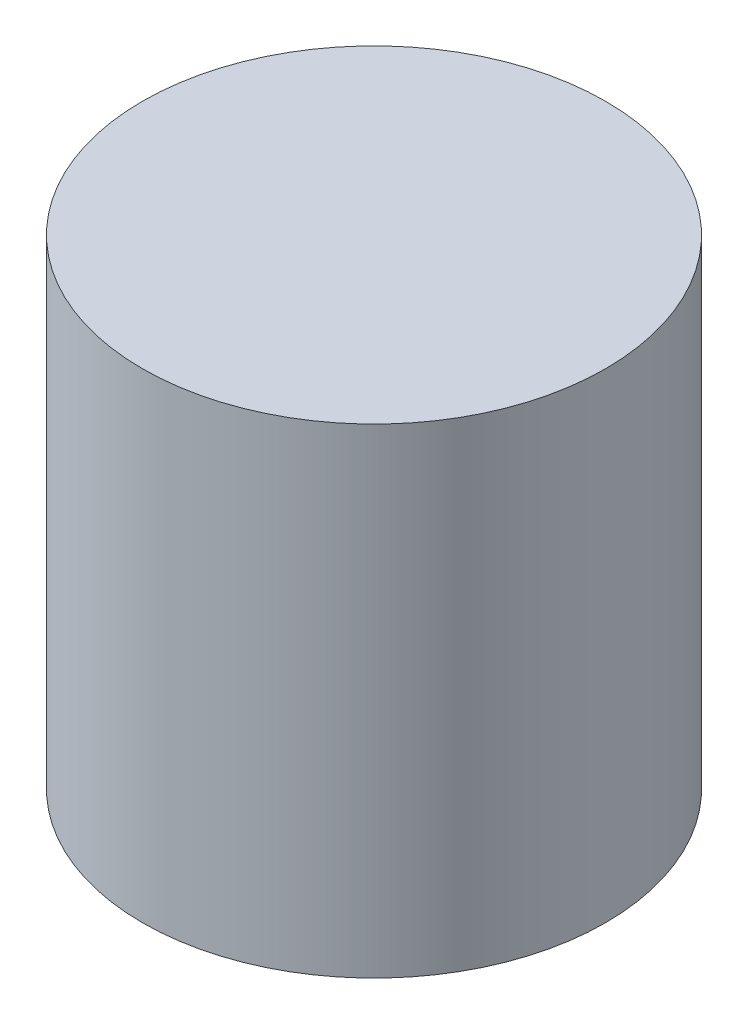
ISO-10303-21;
HEADER;
FILE_DESCRIPTION(('STEP AP214'),'2;1');
FILE_NAME('part.step','',(''),(''),'','','');
FILE_SCHEMA(('AUTOMOTIVE_DESIGN { 1 0 10303 214 1 1 1 1 }'));
ENDSEC;
DATA;
#1=APPLICATION_CONTEXT('core data for automotive mechanical design processes');
#2=APPLICATION_PROTOCOL_DEFINITION('international standard','automotive_design',2000,#1);
#3=PRODUCT_CONTEXT('',#1,'mechanical');
#4=PRODUCT('Part','Part','',(#3));
#5=PRODUCT_RELATED_PRODUCT_CATEGORY('part','',(#4));
#6=PRODUCT_DEFINITION_FORMATION('','',#4);
#7=PRODUCT_DEFINITION_CONTEXT('part definition',#1,'design');
#8=PRODUCT_DEFINITION('design','',#6,#7);
#9=PRODUCT_DEFINITION_SHAPE('','',#8);
#10=(LENGTH_UNIT() NAMED_UNIT(*) SI_UNIT(.MILLI.,.METRE.));
#11=(NAMED_UNIT(*) PLANE_ANGLE_UNIT() SI_UNIT($,.RADIAN.));
#12=(NAMED_UNIT(*) SI_UNIT($,.STERADIAN.) SOLID_ANGLE_UNIT());
#13=UNCERTAINTY_MEASURE_WITH_UNIT(LENGTH_MEASURE(1.E-05),#10,'distance_accuracy_value','');
#14=(GEOMETRIC_REPRESENTATION_CONTEXT(3) GLOBAL_UNCERTAINTY_ASSIGNED_CONTEXT((#13)) GLOBAL_UNIT_ASSIGNED_CONTEXT((#10,
#11,#12)) REPRESENTATION_CONTEXT('',''));
#15=CARTESIAN_POINT('',(0.,0.,0.));
#16=DIRECTION('',(0.,0.,1.));
#17=DIRECTION('',(1.,0.,0.));
#18=AXIS2_PLACEMENT_3D('',#15,#16,#17);
#19=CARTESIAN_POINT('',(1.00619284063597,71.,-0.701478064453642));
#20=DIRECTION('',(0.,-1.,0.));
#21=DIRECTION('',(0.,0.,-1.));
#22=AXIS2_PLACEMENT_3D('',#19,#20,#21);
#23=CYLINDRICAL_SURFACE('',#22,34.2724380364784);
#24=CARTESIAN_POINT('',(1.00619284063597,71.,-0.701478064453642));
#25=DIRECTION('',(0.,1.,0.));
#26=DIRECTION('',(0.,0.,1.));
#27=AXIS2_PLACEMENT_3D('',#24,#25,#26);
#28=CIRCLE('',#27,34.2724380364784);
#29=CARTESIAN_POINT('',(1.00619284063597,71.,33.5709599720247));
#30=VERTEX_POINT('',#29);
#31=EDGE_CURVE('E10',#30,#30,#28,.T.);
#32=ORIENTED_EDGE('',*,*,#31,.F.);
#33=EDGE_LOOP('',(#32));
#34=FACE_BOUND('',#33,.T.);
#35=CARTESIAN_POINT('',(1.00619284063597,0.,-0.701478064453642));
#36=DIRECTION('',(0.,1.,0.));
#37=DIRECTION('',(0.,0.,1.));
#38=AXIS2_PLACEMENT_3D('',#35,#36,#37);
#39=CIRCLE('',#38,34.2724380364784);
#40=CARTESIAN_POINT('',(1.00619284063597,0.,33.5709599720247));
#41=VERTEX_POINT('',#40);
#42=EDGE_CURVE('E46',#41,#41,#39,.T.);
#43=ORIENTED_EDGE('',*,*,#42,.T.);
#44=EDGE_LOOP('',(#43));
#45=FACE_BOUND('',#44,.T.);
#46=ADVANCED_FACE('F43',(#34,#45),#23,.T.);
#47=CARTESIAN_POINT('',(1.00619284063597,71.,-0.701478064453642));
#48=DIRECTION('',(0.,1.,0.));
#49=DIRECTION('',(0.,0.,1.));
#50=AXIS2_PLACEMENT_3D('',#47,#48,#49);
#51=PLANE('',#50);
#52=ORIENTED_EDGE('',*,*,#31,.T.);
#53=EDGE_LOOP('',(#52));
#54=FACE_BOUND('',#53,.T.);
#55=ADVANCED_FACE('F60',(#54),#51,.T.);
#56=CARTESIAN_POINT('',(1.00619284063597,0.,-0.701478064453642));
#57=DIRECTION('',(0.,1.,0.));
#58=DIRECTION('',(0.,0.,1.));
#59=AXIS2_PLACEMENT_3D('',#56,#57,#58);
#60=PLANE('',#59);
#61=ORIENTED_EDGE('',*,*,#42,.F.);
#62=EDGE_LOOP('',(#61));
#63=FACE_BOUND('',#62,.T.);
#64=ADVANCED_FACE('F58',(#63),#60,.F.);
#65=CLOSED_SHELL('',(#46,#55,#64));
#66=MANIFOLD_SOLID_BREP('B2',#65);
#67=ADVANCED_BREP_SHAPE_REPRESENTATION('',(#18,#66),#14);
#68=SHAPE_DEFINITION_REPRESENTATION(#9,#67);
ENDSEC;
END-ISO-10303-21;
